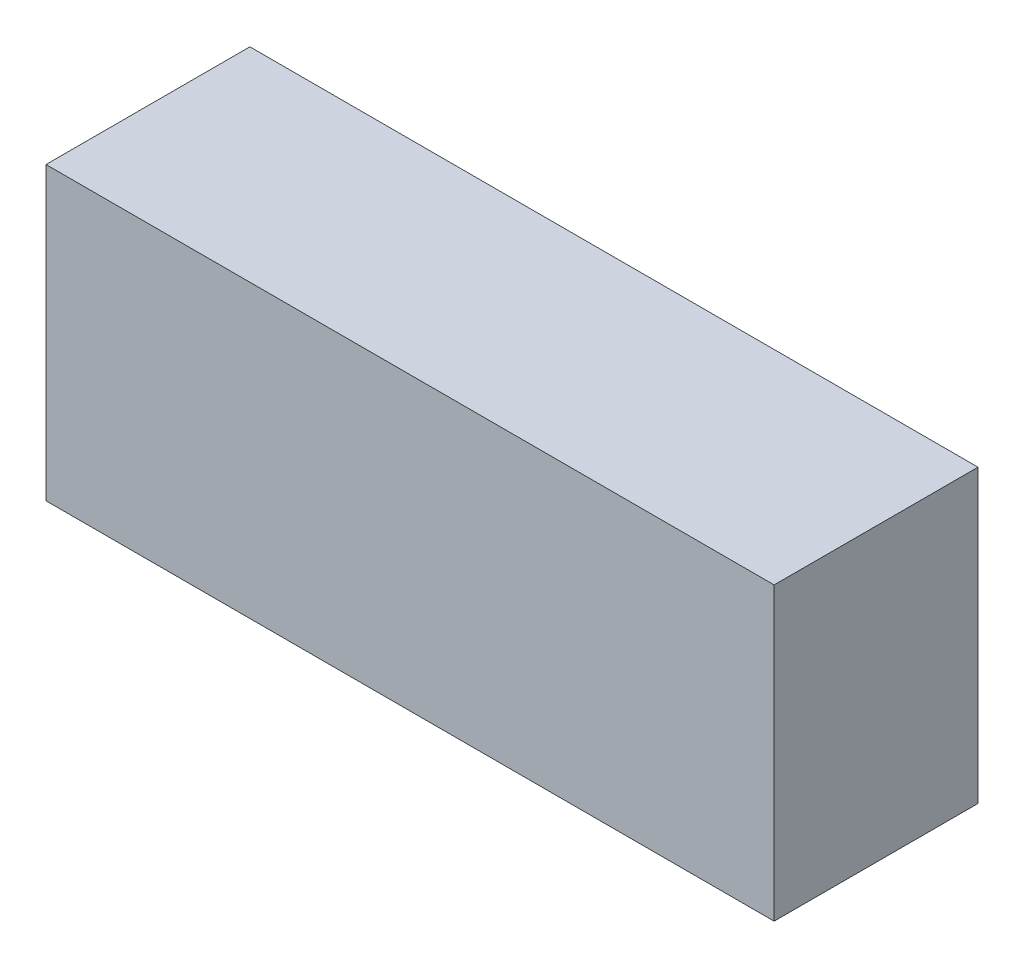
ISO-10303-21;
HEADER;
FILE_DESCRIPTION(('STEP AP214'),'2;1');
FILE_NAME('part.step','',(''),(''),'','','');
FILE_SCHEMA(('AUTOMOTIVE_DESIGN { 1 0 10303 214 1 1 1 1 }'));
ENDSEC;
DATA;
#1=APPLICATION_CONTEXT('core data for automotive mechanical design processes');
#2=APPLICATION_PROTOCOL_DEFINITION('international standard','automotive_design',2000,#1);
#3=PRODUCT_CONTEXT('',#1,'mechanical');
#4=PRODUCT('Part','Part','',(#3));
#5=PRODUCT_RELATED_PRODUCT_CATEGORY('part','',(#4));
#6=PRODUCT_DEFINITION_FORMATION('','',#4);
#7=PRODUCT_DEFINITION_CONTEXT('part definition',#1,'design');
#8=PRODUCT_DEFINITION('design','',#6,#7);
#9=PRODUCT_DEFINITION_SHAPE('','',#8);
#10=(LENGTH_UNIT() NAMED_UNIT(*) SI_UNIT(.MILLI.,.METRE.));
#11=(NAMED_UNIT(*) PLANE_ANGLE_UNIT() SI_UNIT($,.RADIAN.));
#12=(NAMED_UNIT(*) SI_UNIT($,.STERADIAN.) SOLID_ANGLE_UNIT());
#13=UNCERTAINTY_MEASURE_WITH_UNIT(LENGTH_MEASURE(1.E-05),#10,'distance_accuracy_value','');
#14=(GEOMETRIC_REPRESENTATION_CONTEXT(3) GLOBAL_UNCERTAINTY_ASSIGNED_CONTEXT((#13)) GLOBAL_UNIT_ASSIGNED_CONTEXT((#10,
#11,#12)) REPRESENTATION_CONTEXT('',''));
#15=CARTESIAN_POINT('',(0.,0.,0.));
#16=DIRECTION('',(0.,0.,1.));
#17=DIRECTION('',(1.,0.,0.));
#18=AXIS2_PLACEMENT_3D('',#15,#16,#17);
#19=CARTESIAN_POINT('',(-2.50000008,-1.00000054,1.39999974));
#20=DIRECTION('',(0.,0.,1.));
#21=DIRECTION('',(1.,0.,0.));
#22=AXIS2_PLACEMENT_3D('',#19,#20,#21);
#23=PLANE('',#22);
#24=DIRECTION('',(-1.,0.,0.));
#25=VECTOR('',#24,1.);
#26=CARTESIAN_POINT('',(-2.50000008,1.00000054,1.39999974));
#27=LINE('',#26,#25);
#28=CARTESIAN_POINT('',(-2.50000008,1.00000054,1.39999974));
#29=VERTEX_POINT('',#28);
#30=CARTESIAN_POINT('',(2.50000008,1.00000054,1.39999974));
#31=VERTEX_POINT('',#30);
#32=EDGE_CURVE('E53',#29,#31,#27,.F.);
#33=ORIENTED_EDGE('',*,*,#32,.F.);
#34=DIRECTION('',(0.,1.,0.));
#35=VECTOR('',#34,1.);
#36=CARTESIAN_POINT('',(-2.50000008,-1.00000054,1.39999974));
#37=LINE('',#36,#35);
#38=CARTESIAN_POINT('',(-2.50000008,-1.00000053999999,1.39999974));
#39=VERTEX_POINT('',#38);
#40=EDGE_CURVE('E68',#39,#29,#37,.T.);
#41=ORIENTED_EDGE('',*,*,#40,.F.);
#42=DIRECTION('',(1.,0.,0.));
#43=VECTOR('',#42,1.);
#44=CARTESIAN_POINT('',(2.50000008,-1.00000054,1.39999974));
#45=LINE('',#44,#43);
#46=CARTESIAN_POINT('',(2.50000008,-1.00000054,1.39999974));
#47=VERTEX_POINT('',#46);
#48=EDGE_CURVE('E20',#47,#39,#45,.F.);
#49=ORIENTED_EDGE('',*,*,#48,.F.);
#50=DIRECTION('',(0.,1.,0.));
#51=VECTOR('',#50,1.);
#52=CARTESIAN_POINT('',(2.50000008,1.00000054,1.39999974));
#53=LINE('',#52,#51);
#54=EDGE_CURVE('E58',#31,#47,#53,.F.);
#55=ORIENTED_EDGE('',*,*,#54,.F.);
#56=EDGE_LOOP('',(#33,#41,#49,#55));
#57=FACE_BOUND('',#56,.T.);
#58=ADVANCED_FACE('F17',(#57),#23,.T.);
#59=CARTESIAN_POINT('',(2.50000008,-1.00000054,0.));
#60=DIRECTION('',(0.,-1.,0.));
#61=DIRECTION('',(1.,0.,0.));
#62=AXIS2_PLACEMENT_3D('',#59,#60,#61);
#63=PLANE('',#62);
#64=DIRECTION('',(0.,0.,1.));
#65=VECTOR('',#64,1.);
#66=CARTESIAN_POINT('',(-2.50000008,-1.00000054,0.));
#67=LINE('',#66,#65);
#68=CARTESIAN_POINT('',(-2.50000008,-1.00000053999999,0.));
#69=VERTEX_POINT('',#68);
#70=EDGE_CURVE('E79',#69,#39,#67,.T.);
#71=ORIENTED_EDGE('',*,*,#70,.F.);
#72=DIRECTION('',(1.,0.,0.));
#73=VECTOR('',#72,1.);
#74=CARTESIAN_POINT('',(-2.50000008,-1.00000054,0.));
#75=LINE('',#74,#73);
#76=CARTESIAN_POINT('',(2.50000008,-1.00000054,0.));
#77=VERTEX_POINT('',#76);
#78=EDGE_CURVE('E74',#69,#77,#75,.T.);
#79=ORIENTED_EDGE('',*,*,#78,.T.);
#80=DIRECTION('',(0.,0.,-1.));
#81=VECTOR('',#80,1.);
#82=CARTESIAN_POINT('',(2.50000008,-1.00000054,0.));
#83=LINE('',#82,#81);
#84=EDGE_CURVE('E63',#47,#77,#83,.T.);
#85=ORIENTED_EDGE('',*,*,#84,.F.);
#86=ORIENTED_EDGE('',*,*,#48,.T.);
#87=EDGE_LOOP('',(#71,#79,#85,#86));
#88=FACE_BOUND('',#87,.T.);
#89=ADVANCED_FACE('F73',(#88),#63,.T.);
#90=CARTESIAN_POINT('',(2.50000008,1.00000054,0.));
#91=DIRECTION('',(1.,0.,0.));
#92=DIRECTION('',(0.,0.,-1.));
#93=AXIS2_PLACEMENT_3D('',#90,#91,#92);
#94=PLANE('',#93);
#95=ORIENTED_EDGE('',*,*,#84,.T.);
#96=DIRECTION('',(0.,1.,0.));
#97=VECTOR('',#96,1.);
#98=CARTESIAN_POINT('',(2.50000008,-1.00000054,0.));
#99=LINE('',#98,#97);
#100=CARTESIAN_POINT('',(2.50000008,1.00000054,0.));
#101=VERTEX_POINT('',#100);
#102=EDGE_CURVE('E84',#77,#101,#99,.T.);
#103=ORIENTED_EDGE('',*,*,#102,.T.);
#104=DIRECTION('',(0.,0.,1.));
#105=VECTOR('',#104,1.);
#106=CARTESIAN_POINT('',(2.50000008,1.00000053999999,0.));
#107=LINE('',#106,#105);
#108=EDGE_CURVE('E65',#31,#101,#107,.F.);
#109=ORIENTED_EDGE('',*,*,#108,.F.);
#110=ORIENTED_EDGE('',*,*,#54,.T.);
#111=EDGE_LOOP('',(#95,#103,#109,#110));
#112=FACE_BOUND('',#111,.T.);
#113=ADVANCED_FACE('F60',(#112),#94,.T.);
#114=CARTESIAN_POINT('',(-2.50000008,1.00000054,0.));
#115=DIRECTION('',(0.,1.,0.));
#116=DIRECTION('',(-1.,0.,0.));
#117=AXIS2_PLACEMENT_3D('',#114,#115,#116);
#118=PLANE('',#117);
#119=ORIENTED_EDGE('',*,*,#108,.T.);
#120=DIRECTION('',(1.,0.,0.));
#121=VECTOR('',#120,1.);
#122=CARTESIAN_POINT('',(-2.50000008,1.00000054,0.));
#123=LINE('',#122,#121);
#124=CARTESIAN_POINT('',(-2.50000008,1.00000054,0.));
#125=VERTEX_POINT('',#124);
#126=EDGE_CURVE('E26',#101,#125,#123,.F.);
#127=ORIENTED_EDGE('',*,*,#126,.T.);
#128=DIRECTION('',(0.,0.,1.));
#129=VECTOR('',#128,1.);
#130=CARTESIAN_POINT('',(-2.50000008,1.00000054,0.));
#131=LINE('',#130,#129);
#132=EDGE_CURVE('E34',#29,#125,#131,.F.);
#133=ORIENTED_EDGE('',*,*,#132,.F.);
#134=ORIENTED_EDGE('',*,*,#32,.T.);
#135=EDGE_LOOP('',(#119,#127,#133,#134));
#136=FACE_BOUND('',#135,.T.);
#137=ADVANCED_FACE('F88',(#136),#118,.T.);
#138=CARTESIAN_POINT('',(-2.50000008,-1.00000054,0.));
#139=DIRECTION('',(-1.,0.,0.));
#140=DIRECTION('',(0.,0.,1.));
#141=AXIS2_PLACEMENT_3D('',#138,#139,#140);
#142=PLANE('',#141);
#143=ORIENTED_EDGE('',*,*,#132,.T.);
#144=DIRECTION('',(0.,1.,0.));
#145=VECTOR('',#144,1.);
#146=CARTESIAN_POINT('',(-2.50000008,-1.00000054,0.));
#147=LINE('',#146,#145);
#148=EDGE_CURVE('E11',#125,#69,#147,.F.);
#149=ORIENTED_EDGE('',*,*,#148,.T.);
#150=ORIENTED_EDGE('',*,*,#70,.T.);
#151=ORIENTED_EDGE('',*,*,#40,.T.);
#152=EDGE_LOOP('',(#143,#149,#150,#151));
#153=FACE_BOUND('',#152,.T.);
#154=ADVANCED_FACE('F91',(#153),#142,.T.);
#155=CARTESIAN_POINT('',(-2.50000008,-1.00000054,0.));
#156=DIRECTION('',(0.,0.,1.));
#157=DIRECTION('',(1.,0.,0.));
#158=AXIS2_PLACEMENT_3D('',#155,#156,#157);
#159=PLANE('',#158);
#160=ORIENTED_EDGE('',*,*,#126,.F.);
#161=ORIENTED_EDGE('',*,*,#102,.F.);
#162=ORIENTED_EDGE('',*,*,#78,.F.);
#163=ORIENTED_EDGE('',*,*,#148,.F.);
#164=EDGE_LOOP('',(#160,#161,#162,#163));
#165=FACE_BOUND('',#164,.T.);
#166=ADVANCED_FACE('F90',(#165),#159,.F.);
#167=CLOSED_SHELL('',(#58,#89,#113,#137,#154,#166));
#168=MANIFOLD_SOLID_BREP('B1',#167);
#169=ADVANCED_BREP_SHAPE_REPRESENTATION('',(#18,#168),#14);
#170=SHAPE_DEFINITION_REPRESENTATION(#9,#169);
ENDSEC;
END-ISO-10303-21;
